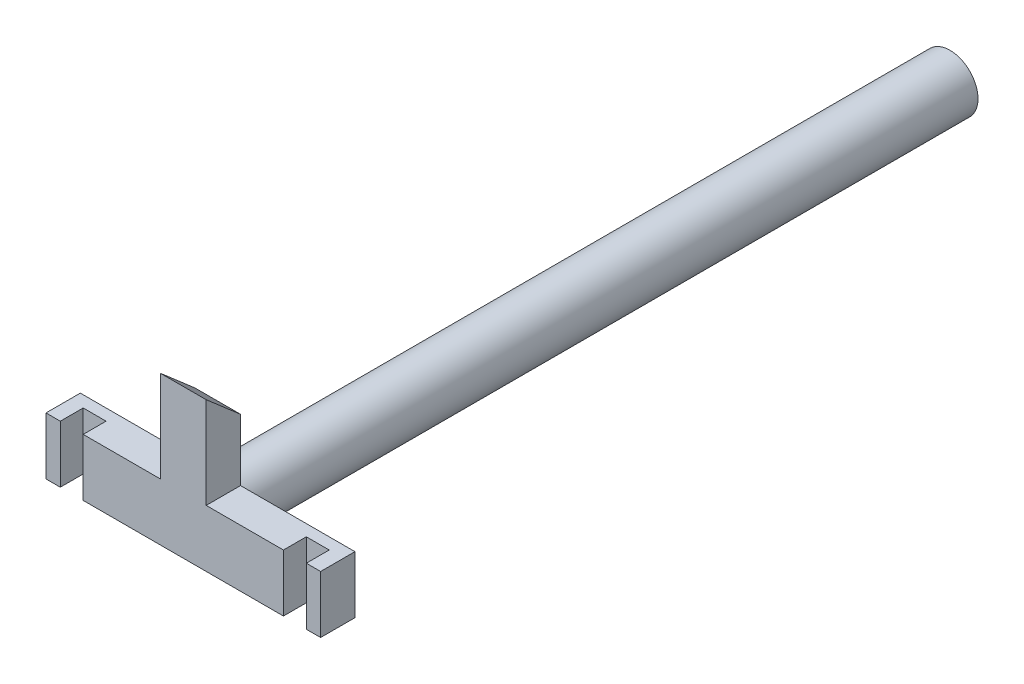
ISO-10303-21;
HEADER;
FILE_DESCRIPTION(('STEP AP214'),'2;1');
FILE_NAME('part.step','',(''),(''),'','','');
FILE_SCHEMA(('AUTOMOTIVE_DESIGN { 1 0 10303 214 1 1 1 1 }'));
ENDSEC;
DATA;
#1=APPLICATION_CONTEXT('core data for automotive mechanical design processes');
#2=APPLICATION_PROTOCOL_DEFINITION('international standard','automotive_design',2000,#1);
#3=PRODUCT_CONTEXT('',#1,'mechanical');
#4=PRODUCT('Part','Part','',(#3));
#5=PRODUCT_RELATED_PRODUCT_CATEGORY('part','',(#4));
#6=PRODUCT_DEFINITION_FORMATION('','',#4);
#7=PRODUCT_DEFINITION_CONTEXT('part definition',#1,'design');
#8=PRODUCT_DEFINITION('design','',#6,#7);
#9=PRODUCT_DEFINITION_SHAPE('','',#8);
#10=(LENGTH_UNIT() NAMED_UNIT(*) SI_UNIT(.MILLI.,.METRE.));
#11=(NAMED_UNIT(*) PLANE_ANGLE_UNIT() SI_UNIT($,.RADIAN.));
#12=(NAMED_UNIT(*) SI_UNIT($,.STERADIAN.) SOLID_ANGLE_UNIT());
#13=UNCERTAINTY_MEASURE_WITH_UNIT(LENGTH_MEASURE(1.E-05),#10,'distance_accuracy_value','');
#14=(GEOMETRIC_REPRESENTATION_CONTEXT(3) GLOBAL_UNCERTAINTY_ASSIGNED_CONTEXT((#13)) GLOBAL_UNIT_ASSIGNED_CONTEXT((#10,
#11,#12)) REPRESENTATION_CONTEXT('',''));
#15=CARTESIAN_POINT('',(0.,0.,0.));
#16=DIRECTION('',(0.,0.,1.));
#17=DIRECTION('',(1.,0.,0.));
#18=AXIS2_PLACEMENT_3D('',#15,#16,#17);
#19=CARTESIAN_POINT('',(-12.,2.5,67.));
#20=DIRECTION('',(0.,-1.,0.));
#21=DIRECTION('',(0.,0.,-1.));
#22=AXIS2_PLACEMENT_3D('',#19,#20,#21);
#23=PLANE('',#22);
#24=DIRECTION('',(0.,0.,1.));
#25=VECTOR('',#24,1.);
#26=CARTESIAN_POINT('',(-2.,2.5,55.0557280900008));
#27=LINE('',#26,#25);
#28=CARTESIAN_POINT('',(-2.,2.5,64.));
#29=VERTEX_POINT('',#28);
#30=CARTESIAN_POINT('',(-2.,2.5,67.));
#31=VERTEX_POINT('',#30);
#32=EDGE_CURVE('E68',#29,#31,#27,.T.);
#33=ORIENTED_EDGE('',*,*,#32,.F.);
#34=DIRECTION('',(-1.,0.,0.));
#35=VECTOR('',#34,1.);
#36=CARTESIAN_POINT('',(-12.,2.5,64.));
#37=LINE('',#36,#35);
#38=CARTESIAN_POINT('',(-12.,2.5,64.));
#39=VERTEX_POINT('',#38);
#40=EDGE_CURVE('E297',#29,#39,#37,.T.);
#41=ORIENTED_EDGE('',*,*,#40,.T.);
#42=DIRECTION('',(0.,0.,-1.));
#43=VECTOR('',#42,1.);
#44=CARTESIAN_POINT('',(-12.,2.5,67.));
#45=LINE('',#44,#43);
#46=CARTESIAN_POINT('',(-12.,2.5,67.));
#47=VERTEX_POINT('',#46);
#48=EDGE_CURVE('E313',#47,#39,#45,.T.);
#49=ORIENTED_EDGE('',*,*,#48,.F.);
#50=DIRECTION('',(-1.,0.,0.));
#51=VECTOR('',#50,1.);
#52=CARTESIAN_POINT('',(-12.,2.5,67.));
#53=LINE('',#52,#51);
#54=CARTESIAN_POINT('',(-10.75,2.5,67.));
#55=VERTEX_POINT('',#54);
#56=EDGE_CURVE('E277',#55,#47,#53,.T.);
#57=ORIENTED_EDGE('',*,*,#56,.F.);
#58=DIRECTION('',(0.,0.,1.));
#59=VECTOR('',#58,1.);
#60=CARTESIAN_POINT('',(-10.75,2.5,65.));
#61=LINE('',#60,#59);
#62=CARTESIAN_POINT('',(-10.75,2.5,65.));
#63=VERTEX_POINT('',#62);
#64=EDGE_CURVE('E242',#63,#55,#61,.T.);
#65=ORIENTED_EDGE('',*,*,#64,.F.);
#66=DIRECTION('',(-1.,0.,0.));
#67=VECTOR('',#66,1.);
#68=CARTESIAN_POINT('',(-8.75,2.5,65.));
#69=LINE('',#68,#67);
#70=CARTESIAN_POINT('',(-8.75,2.5,65.));
#71=VERTEX_POINT('',#70);
#72=EDGE_CURVE('E266',#71,#63,#69,.T.);
#73=ORIENTED_EDGE('',*,*,#72,.F.);
#74=DIRECTION('',(0.,0.,1.));
#75=VECTOR('',#74,1.);
#76=CARTESIAN_POINT('',(-8.75,2.5,65.));
#77=LINE('',#76,#75);
#78=CARTESIAN_POINT('',(-8.75,2.5,67.));
#79=VERTEX_POINT('',#78);
#80=EDGE_CURVE('E237',#71,#79,#77,.T.);
#81=ORIENTED_EDGE('',*,*,#80,.T.);
#82=EDGE_CURVE('E284',#31,#79,#53,.T.);
#83=ORIENTED_EDGE('',*,*,#82,.F.);
#84=EDGE_LOOP('',(#33,#41,#49,#57,#65,#73,#81,#83));
#85=FACE_BOUND('',#84,.T.);
#86=ADVANCED_FACE('F44',(#85),#23,.F.);
#87=CARTESIAN_POINT('',(0.,0.,67.));
#88=DIRECTION('',(0.,0.,1.));
#89=DIRECTION('',(1.,0.,0.));
#90=AXIS2_PLACEMENT_3D('',#87,#88,#89);
#91=PLANE('',#90);
#92=DIRECTION('',(0.,1.,0.));
#93=VECTOR('',#92,1.);
#94=CARTESIAN_POINT('',(10.75,2.5,67.));
#95=LINE('',#94,#93);
#96=CARTESIAN_POINT('',(10.75,-2.5,67.));
#97=VERTEX_POINT('',#96);
#98=CARTESIAN_POINT('',(10.75,2.5,67.));
#99=VERTEX_POINT('',#98);
#100=EDGE_CURVE('E217',#97,#99,#95,.T.);
#101=ORIENTED_EDGE('',*,*,#100,.F.);
#102=DIRECTION('',(1.,0.,0.));
#103=VECTOR('',#102,1.);
#104=CARTESIAN_POINT('',(-12.,-2.5,67.));
#105=LINE('',#104,#103);
#106=CARTESIAN_POINT('',(12.,-2.5,67.));
#107=VERTEX_POINT('',#106);
#108=EDGE_CURVE('E287',#97,#107,#105,.T.);
#109=ORIENTED_EDGE('',*,*,#108,.T.);
#110=DIRECTION('',(0.,1.,0.));
#111=VECTOR('',#110,1.);
#112=CARTESIAN_POINT('',(12.,2.5,67.));
#113=LINE('',#112,#111);
#114=CARTESIAN_POINT('',(12.,2.5,67.));
#115=VERTEX_POINT('',#114);
#116=EDGE_CURVE('E273',#107,#115,#113,.T.);
#117=ORIENTED_EDGE('',*,*,#116,.T.);
#118=EDGE_CURVE('E279',#115,#99,#53,.T.);
#119=ORIENTED_EDGE('',*,*,#118,.T.);
#120=EDGE_LOOP('',(#101,#109,#117,#119));
#121=FACE_BOUND('',#120,.T.);
#122=ADVANCED_FACE('F338',(#121),#91,.T.);
#123=DIRECTION('',(0.,-1.,0.));
#124=VECTOR('',#123,1.);
#125=CARTESIAN_POINT('',(8.75,2.5,67.));
#126=LINE('',#125,#124);
#127=CARTESIAN_POINT('',(8.75,2.5,67.));
#128=VERTEX_POINT('',#127);
#129=CARTESIAN_POINT('',(8.75,-2.5,67.));
#130=VERTEX_POINT('',#129);
#131=EDGE_CURVE('E204',#128,#130,#126,.T.);
#132=ORIENTED_EDGE('',*,*,#131,.F.);
#133=CARTESIAN_POINT('',(2.,2.5,67.));
#134=VERTEX_POINT('',#133);
#135=EDGE_CURVE('E184',#128,#134,#53,.T.);
#136=ORIENTED_EDGE('',*,*,#135,.T.);
#137=DIRECTION('',(0.,1.,0.));
#138=VECTOR('',#137,1.);
#139=CARTESIAN_POINT('',(2.,10.5,67.));
#140=LINE('',#139,#138);
#141=CARTESIAN_POINT('',(2.,10.5,67.));
#142=VERTEX_POINT('',#141);
#143=EDGE_CURVE('E172',#134,#142,#140,.T.);
#144=ORIENTED_EDGE('',*,*,#143,.T.);
#145=DIRECTION('',(-1.,0.,0.));
#146=VECTOR('',#145,1.);
#147=CARTESIAN_POINT('',(-2.,10.5,67.));
#148=LINE('',#147,#146);
#149=CARTESIAN_POINT('',(-2.,10.5,67.));
#150=VERTEX_POINT('',#149);
#151=EDGE_CURVE('E159',#142,#150,#148,.T.);
#152=ORIENTED_EDGE('',*,*,#151,.T.);
#153=DIRECTION('',(0.,-1.,0.));
#154=VECTOR('',#153,1.);
#155=CARTESIAN_POINT('',(-2.,10.5,67.));
#156=LINE('',#155,#154);
#157=EDGE_CURVE('E171',#150,#31,#156,.T.);
#158=ORIENTED_EDGE('',*,*,#157,.T.);
#159=ORIENTED_EDGE('',*,*,#82,.T.);
#160=DIRECTION('',(0.,1.,0.));
#161=VECTOR('',#160,1.);
#162=CARTESIAN_POINT('',(-8.75,2.5,67.));
#163=LINE('',#162,#161);
#164=CARTESIAN_POINT('',(-8.75,-2.5,67.));
#165=VERTEX_POINT('',#164);
#166=EDGE_CURVE('E220',#165,#79,#163,.T.);
#167=ORIENTED_EDGE('',*,*,#166,.F.);
#168=EDGE_CURVE('E293',#165,#130,#105,.T.);
#169=ORIENTED_EDGE('',*,*,#168,.T.);
#170=EDGE_LOOP('',(#132,#136,#144,#152,#158,#159,#167,#169));
#171=FACE_BOUND('',#170,.T.);
#172=ADVANCED_FACE('F183',(#171),#91,.T.);
#173=CARTESIAN_POINT('',(0.,0.,64.));
#174=DIRECTION('',(0.,0.,-1.));
#175=DIRECTION('',(-1.,0.,0.));
#176=AXIS2_PLACEMENT_3D('',#173,#174,#175);
#177=CYLINDRICAL_SURFACE('',#176,2.45);
#178=CARTESIAN_POINT('',(0.,0.,64.));
#179=DIRECTION('',(0.,0.,1.));
#180=DIRECTION('',(1.,0.,0.));
#181=AXIS2_PLACEMENT_3D('',#178,#179,#180);
#182=CIRCLE('',#181,2.45);
#183=CARTESIAN_POINT('',(2.45,0.,64.));
#184=VERTEX_POINT('',#183);
#185=EDGE_CURVE('E11',#184,#184,#182,.T.);
#186=ORIENTED_EDGE('',*,*,#185,.F.);
#187=EDGE_LOOP('',(#186));
#188=FACE_BOUND('',#187,.T.);
#189=CARTESIAN_POINT('',(0.,0.,0.));
#190=DIRECTION('',(0.,0.,1.));
#191=DIRECTION('',(1.,0.,0.));
#192=AXIS2_PLACEMENT_3D('',#189,#190,#191);
#193=CIRCLE('',#192,2.45);
#194=CARTESIAN_POINT('',(2.45,0.,0.));
#195=VERTEX_POINT('',#194);
#196=EDGE_CURVE('E48',#195,#195,#193,.T.);
#197=ORIENTED_EDGE('',*,*,#196,.T.);
#198=EDGE_LOOP('',(#197));
#199=FACE_BOUND('',#198,.T.);
#200=ADVANCED_FACE('F46',(#188,#199),#177,.T.);
#201=CARTESIAN_POINT('',(0.,0.,0.));
#202=DIRECTION('',(0.,0.,1.));
#203=DIRECTION('',(1.,0.,0.));
#204=AXIS2_PLACEMENT_3D('',#201,#202,#203);
#205=PLANE('',#204);
#206=ORIENTED_EDGE('',*,*,#196,.F.);
#207=EDGE_LOOP('',(#206));
#208=FACE_BOUND('',#207,.T.);
#209=ADVANCED_FACE('F326',(#208),#205,.F.);
#210=CARTESIAN_POINT('',(12.,2.5,67.));
#211=DIRECTION('',(-1.,0.,0.));
#212=DIRECTION('',(0.,0.,1.));
#213=AXIS2_PLACEMENT_3D('',#210,#211,#212);
#214=PLANE('',#213);
#215=DIRECTION('',(0.,1.,0.));
#216=VECTOR('',#215,1.);
#217=CARTESIAN_POINT('',(12.,2.5,64.));
#218=LINE('',#217,#216);
#219=CARTESIAN_POINT('',(12.,-2.5,64.));
#220=VERTEX_POINT('',#219);
#221=CARTESIAN_POINT('',(12.,2.5,64.));
#222=VERTEX_POINT('',#221);
#223=EDGE_CURVE('E226',#220,#222,#218,.T.);
#224=ORIENTED_EDGE('',*,*,#223,.T.);
#225=DIRECTION('',(0.,0.,-1.));
#226=VECTOR('',#225,1.);
#227=CARTESIAN_POINT('',(12.,2.5,67.));
#228=LINE('',#227,#226);
#229=EDGE_CURVE('E317',#115,#222,#228,.T.);
#230=ORIENTED_EDGE('',*,*,#229,.F.);
#231=ORIENTED_EDGE('',*,*,#116,.F.);
#232=DIRECTION('',(0.,0.,-1.));
#233=VECTOR('',#232,1.);
#234=CARTESIAN_POINT('',(12.,-2.5,67.));
#235=LINE('',#234,#233);
#236=EDGE_CURVE('E292',#107,#220,#235,.T.);
#237=ORIENTED_EDGE('',*,*,#236,.T.);
#238=EDGE_LOOP('',(#224,#230,#231,#237));
#239=FACE_BOUND('',#238,.T.);
#240=ADVANCED_FACE('F328',(#239),#214,.F.);
#241=CARTESIAN_POINT('',(2.,2.5,64.));
#242=VERTEX_POINT('',#241);
#243=EDGE_CURVE('E298',#222,#242,#37,.T.);
#244=ORIENTED_EDGE('',*,*,#243,.T.);
#245=DIRECTION('',(0.,0.,1.));
#246=VECTOR('',#245,1.);
#247=CARTESIAN_POINT('',(2.,2.5,55.0557280900008));
#248=LINE('',#247,#246);
#249=EDGE_CURVE('E60',#242,#134,#248,.T.);
#250=ORIENTED_EDGE('',*,*,#249,.T.);
#251=ORIENTED_EDGE('',*,*,#135,.F.);
#252=DIRECTION('',(0.,0.,1.));
#253=VECTOR('',#252,1.);
#254=CARTESIAN_POINT('',(8.75,2.5,65.));
#255=LINE('',#254,#253);
#256=CARTESIAN_POINT('',(8.75,2.5,65.));
#257=VERTEX_POINT('',#256);
#258=EDGE_CURVE('E231',#257,#128,#255,.T.);
#259=ORIENTED_EDGE('',*,*,#258,.F.);
#260=DIRECTION('',(-1.,0.,0.));
#261=VECTOR('',#260,1.);
#262=CARTESIAN_POINT('',(8.75,2.5,65.));
#263=LINE('',#262,#261);
#264=CARTESIAN_POINT('',(10.75,2.5,65.));
#265=VERTEX_POINT('',#264);
#266=EDGE_CURVE('E203',#265,#257,#263,.T.);
#267=ORIENTED_EDGE('',*,*,#266,.F.);
#268=DIRECTION('',(0.,0.,1.));
#269=VECTOR('',#268,1.);
#270=CARTESIAN_POINT('',(10.75,2.5,65.));
#271=LINE('',#270,#269);
#272=EDGE_CURVE('E216',#265,#99,#271,.T.);
#273=ORIENTED_EDGE('',*,*,#272,.T.);
#274=ORIENTED_EDGE('',*,*,#118,.F.);
#275=ORIENTED_EDGE('',*,*,#229,.T.);
#276=EDGE_LOOP('',(#244,#250,#251,#259,#267,#273,#274,#275));
#277=FACE_BOUND('',#276,.T.);
#278=ADVANCED_FACE('F333',(#277),#23,.F.);
#279=CARTESIAN_POINT('',(-12.,2.5,67.));
#280=DIRECTION('',(1.,0.,0.));
#281=DIRECTION('',(0.,0.,-1.));
#282=AXIS2_PLACEMENT_3D('',#279,#280,#281);
#283=PLANE('',#282);
#284=DIRECTION('',(0.,-1.,0.));
#285=VECTOR('',#284,1.);
#286=CARTESIAN_POINT('',(-12.,2.5,64.));
#287=LINE('',#286,#285);
#288=CARTESIAN_POINT('',(-12.,-2.5,64.));
#289=VERTEX_POINT('',#288);
#290=EDGE_CURVE('E301',#39,#289,#287,.T.);
#291=ORIENTED_EDGE('',*,*,#290,.T.);
#292=DIRECTION('',(0.,0.,-1.));
#293=VECTOR('',#292,1.);
#294=CARTESIAN_POINT('',(-12.,-2.5,67.));
#295=LINE('',#294,#293);
#296=CARTESIAN_POINT('',(-12.,-2.5,67.));
#297=VERTEX_POINT('',#296);
#298=EDGE_CURVE('E309',#297,#289,#295,.T.);
#299=ORIENTED_EDGE('',*,*,#298,.F.);
#300=DIRECTION('',(0.,-1.,0.));
#301=VECTOR('',#300,1.);
#302=CARTESIAN_POINT('',(-12.,2.5,67.));
#303=LINE('',#302,#301);
#304=EDGE_CURVE('E283',#47,#297,#303,.T.);
#305=ORIENTED_EDGE('',*,*,#304,.F.);
#306=ORIENTED_EDGE('',*,*,#48,.T.);
#307=EDGE_LOOP('',(#291,#299,#305,#306));
#308=FACE_BOUND('',#307,.T.);
#309=ADVANCED_FACE('F349',(#308),#283,.F.);
#310=CARTESIAN_POINT('',(-12.,-2.5,67.));
#311=DIRECTION('',(0.,1.,0.));
#312=DIRECTION('',(0.,0.,1.));
#313=AXIS2_PLACEMENT_3D('',#310,#311,#312);
#314=PLANE('',#313);
#315=ORIENTED_EDGE('',*,*,#108,.F.);
#316=DIRECTION('',(0.,0.,1.));
#317=VECTOR('',#316,1.);
#318=CARTESIAN_POINT('',(10.75,-2.5,65.));
#319=LINE('',#318,#317);
#320=CARTESIAN_POINT('',(10.75,-2.5,65.));
#321=VERTEX_POINT('',#320);
#322=EDGE_CURVE('E223',#321,#97,#319,.T.);
#323=ORIENTED_EDGE('',*,*,#322,.F.);
#324=DIRECTION('',(1.,0.,0.));
#325=VECTOR('',#324,1.);
#326=CARTESIAN_POINT('',(8.75,-2.5,65.));
#327=LINE('',#326,#325);
#328=CARTESIAN_POINT('',(8.75,-2.5,65.));
#329=VERTEX_POINT('',#328);
#330=EDGE_CURVE('E212',#329,#321,#327,.T.);
#331=ORIENTED_EDGE('',*,*,#330,.F.);
#332=DIRECTION('',(0.,0.,1.));
#333=VECTOR('',#332,1.);
#334=CARTESIAN_POINT('',(8.75,-2.5,65.));
#335=LINE('',#334,#333);
#336=EDGE_CURVE('E227',#329,#130,#335,.T.);
#337=ORIENTED_EDGE('',*,*,#336,.T.);
#338=ORIENTED_EDGE('',*,*,#168,.F.);
#339=DIRECTION('',(0.,0.,1.));
#340=VECTOR('',#339,1.);
#341=CARTESIAN_POINT('',(-8.75,-2.5,65.));
#342=LINE('',#341,#340);
#343=CARTESIAN_POINT('',(-8.75,-2.5,65.));
#344=VERTEX_POINT('',#343);
#345=EDGE_CURVE('E249',#344,#165,#342,.T.);
#346=ORIENTED_EDGE('',*,*,#345,.F.);
#347=DIRECTION('',(1.,0.,0.));
#348=VECTOR('',#347,1.);
#349=CARTESIAN_POINT('',(-8.75,-2.5,65.));
#350=LINE('',#349,#348);
#351=CARTESIAN_POINT('',(-10.75,-2.5,65.));
#352=VERTEX_POINT('',#351);
#353=EDGE_CURVE('E241',#352,#344,#350,.T.);
#354=ORIENTED_EDGE('',*,*,#353,.F.);
#355=DIRECTION('',(0.,0.,1.));
#356=VECTOR('',#355,1.);
#357=CARTESIAN_POINT('',(-10.75,-2.5,65.));
#358=LINE('',#357,#356);
#359=CARTESIAN_POINT('',(-10.75,-2.5,67.));
#360=VERTEX_POINT('',#359);
#361=EDGE_CURVE('E245',#352,#360,#358,.T.);
#362=ORIENTED_EDGE('',*,*,#361,.T.);
#363=EDGE_CURVE('E288',#297,#360,#105,.T.);
#364=ORIENTED_EDGE('',*,*,#363,.F.);
#365=ORIENTED_EDGE('',*,*,#298,.T.);
#366=DIRECTION('',(1.,0.,0.));
#367=VECTOR('',#366,1.);
#368=CARTESIAN_POINT('',(-12.,-2.5,64.));
#369=LINE('',#368,#367);
#370=EDGE_CURVE('E278',#289,#220,#369,.T.);
#371=ORIENTED_EDGE('',*,*,#370,.T.);
#372=ORIENTED_EDGE('',*,*,#236,.F.);
#373=EDGE_LOOP('',(#315,#323,#331,#337,#338,#346,#354,#362,#364,#365,#371,#372));
#374=FACE_BOUND('',#373,.T.);
#375=ADVANCED_FACE('F354',(#374),#314,.F.);
#376=DIRECTION('',(0.,-1.,0.));
#377=VECTOR('',#376,1.);
#378=CARTESIAN_POINT('',(-10.75,2.5,67.));
#379=LINE('',#378,#377);
#380=EDGE_CURVE('E252',#55,#360,#379,.T.);
#381=ORIENTED_EDGE('',*,*,#380,.F.);
#382=ORIENTED_EDGE('',*,*,#56,.T.);
#383=ORIENTED_EDGE('',*,*,#304,.T.);
#384=ORIENTED_EDGE('',*,*,#363,.T.);
#385=EDGE_LOOP('',(#381,#382,#383,#384));
#386=FACE_BOUND('',#385,.T.);
#387=ADVANCED_FACE('F347',(#386),#91,.T.);
#388=CARTESIAN_POINT('',(0.,0.,64.));
#389=DIRECTION('',(0.,0.,1.));
#390=DIRECTION('',(1.,0.,0.));
#391=AXIS2_PLACEMENT_3D('',#388,#389,#390);
#392=PLANE('',#391);
#393=ORIENTED_EDGE('',*,*,#185,.T.);
#394=EDGE_LOOP('',(#393));
#395=FACE_BOUND('',#394,.T.);
#396=DIRECTION('',(0.,1.,0.));
#397=VECTOR('',#396,1.);
#398=CARTESIAN_POINT('',(-2.,10.5,64.));
#399=LINE('',#398,#397);
#400=CARTESIAN_POINT('',(-2.,7.9,64.));
#401=VERTEX_POINT('',#400);
#402=EDGE_CURVE('E196',#29,#401,#399,.T.);
#403=ORIENTED_EDGE('',*,*,#402,.T.);
#404=DIRECTION('',(1.,0.,0.));
#405=VECTOR('',#404,1.);
#406=CARTESIAN_POINT('',(-12.001,7.9,64.));
#407=LINE('',#406,#405);
#408=CARTESIAN_POINT('',(2.,7.9,64.));
#409=VERTEX_POINT('',#408);
#410=EDGE_CURVE('E180',#401,#409,#407,.T.);
#411=ORIENTED_EDGE('',*,*,#410,.T.);
#412=DIRECTION('',(0.,-1.,0.));
#413=VECTOR('',#412,1.);
#414=CARTESIAN_POINT('',(2.,10.5,64.));
#415=LINE('',#414,#413);
#416=EDGE_CURVE('E178',#409,#242,#415,.T.);
#417=ORIENTED_EDGE('',*,*,#416,.T.);
#418=ORIENTED_EDGE('',*,*,#243,.F.);
#419=ORIENTED_EDGE('',*,*,#223,.F.);
#420=ORIENTED_EDGE('',*,*,#370,.F.);
#421=ORIENTED_EDGE('',*,*,#290,.F.);
#422=ORIENTED_EDGE('',*,*,#40,.F.);
#423=EDGE_LOOP('',(#403,#411,#417,#418,#419,#420,#421,#422));
#424=FACE_BOUND('',#423,.T.);
#425=ADVANCED_FACE('F359',(#395,#424),#392,.F.);
#426=CARTESIAN_POINT('',(-8.75,2.5,65.));
#427=DIRECTION('',(1.,0.,0.));
#428=DIRECTION('',(0.,0.,-1.));
#429=AXIS2_PLACEMENT_3D('',#426,#427,#428);
#430=PLANE('',#429);
#431=ORIENTED_EDGE('',*,*,#166,.T.);
#432=ORIENTED_EDGE('',*,*,#80,.F.);
#433=DIRECTION('',(0.,1.,0.));
#434=VECTOR('',#433,1.);
#435=CARTESIAN_POINT('',(-8.75,2.5,65.));
#436=LINE('',#435,#434);
#437=EDGE_CURVE('E255',#344,#71,#436,.T.);
#438=ORIENTED_EDGE('',*,*,#437,.F.);
#439=ORIENTED_EDGE('',*,*,#345,.T.);
#440=EDGE_LOOP('',(#431,#432,#438,#439));
#441=FACE_BOUND('',#440,.T.);
#442=ADVANCED_FACE('F374',(#441),#430,.F.);
#443=CARTESIAN_POINT('',(-10.75,2.5,65.));
#444=DIRECTION('',(-1.,0.,0.));
#445=DIRECTION('',(0.,0.,1.));
#446=AXIS2_PLACEMENT_3D('',#443,#444,#445);
#447=PLANE('',#446);
#448=ORIENTED_EDGE('',*,*,#380,.T.);
#449=ORIENTED_EDGE('',*,*,#361,.F.);
#450=DIRECTION('',(0.,-1.,0.));
#451=VECTOR('',#450,1.);
#452=CARTESIAN_POINT('',(-10.75,2.5,65.));
#453=LINE('',#452,#451);
#454=EDGE_CURVE('E262',#63,#352,#453,.T.);
#455=ORIENTED_EDGE('',*,*,#454,.F.);
#456=ORIENTED_EDGE('',*,*,#64,.T.);
#457=EDGE_LOOP('',(#448,#449,#455,#456));
#458=FACE_BOUND('',#457,.T.);
#459=ADVANCED_FACE('F401',(#458),#447,.F.);
#460=CARTESIAN_POINT('',(0.,0.,65.));
#461=DIRECTION('',(0.,0.,-1.));
#462=DIRECTION('',(-1.,0.,0.));
#463=AXIS2_PLACEMENT_3D('',#460,#461,#462);
#464=PLANE('',#463);
#465=ORIENTED_EDGE('',*,*,#437,.T.);
#466=ORIENTED_EDGE('',*,*,#72,.T.);
#467=ORIENTED_EDGE('',*,*,#454,.T.);
#468=ORIENTED_EDGE('',*,*,#353,.T.);
#469=EDGE_LOOP('',(#465,#466,#467,#468));
#470=FACE_BOUND('',#469,.T.);
#471=ADVANCED_FACE('F380',(#470),#464,.F.);
#472=CARTESIAN_POINT('',(10.75,2.5,65.));
#473=DIRECTION('',(1.,0.,0.));
#474=DIRECTION('',(0.,0.,-1.));
#475=AXIS2_PLACEMENT_3D('',#472,#473,#474);
#476=PLANE('',#475);
#477=ORIENTED_EDGE('',*,*,#100,.T.);
#478=ORIENTED_EDGE('',*,*,#272,.F.);
#479=DIRECTION('',(0.,1.,0.));
#480=VECTOR('',#479,1.);
#481=CARTESIAN_POINT('',(10.75,2.5,65.));
#482=LINE('',#481,#480);
#483=EDGE_CURVE('E199',#321,#265,#482,.T.);
#484=ORIENTED_EDGE('',*,*,#483,.F.);
#485=ORIENTED_EDGE('',*,*,#322,.T.);
#486=EDGE_LOOP('',(#477,#478,#484,#485));
#487=FACE_BOUND('',#486,.T.);
#488=ADVANCED_FACE('F408',(#487),#476,.F.);
#489=CARTESIAN_POINT('',(8.75,2.5,65.));
#490=DIRECTION('',(-1.,0.,0.));
#491=DIRECTION('',(0.,0.,1.));
#492=AXIS2_PLACEMENT_3D('',#489,#490,#491);
#493=PLANE('',#492);
#494=ORIENTED_EDGE('',*,*,#131,.T.);
#495=ORIENTED_EDGE('',*,*,#336,.F.);
#496=DIRECTION('',(0.,-1.,0.));
#497=VECTOR('',#496,1.);
#498=CARTESIAN_POINT('',(8.75,2.5,65.));
#499=LINE('',#498,#497);
#500=EDGE_CURVE('E208',#257,#329,#499,.T.);
#501=ORIENTED_EDGE('',*,*,#500,.F.);
#502=ORIENTED_EDGE('',*,*,#258,.T.);
#503=EDGE_LOOP('',(#494,#495,#501,#502));
#504=FACE_BOUND('',#503,.T.);
#505=ADVANCED_FACE('F460',(#504),#493,.F.);
#506=CARTESIAN_POINT('',(0.,0.,65.));
#507=DIRECTION('',(0.,0.,1.));
#508=DIRECTION('',(1.,0.,0.));
#509=AXIS2_PLACEMENT_3D('',#506,#507,#508);
#510=PLANE('',#509);
#511=ORIENTED_EDGE('',*,*,#483,.T.);
#512=ORIENTED_EDGE('',*,*,#266,.T.);
#513=ORIENTED_EDGE('',*,*,#500,.T.);
#514=ORIENTED_EDGE('',*,*,#330,.T.);
#515=EDGE_LOOP('',(#511,#512,#513,#514));
#516=FACE_BOUND('',#515,.T.);
#517=ADVANCED_FACE('F470',(#516),#510,.T.);
#518=CARTESIAN_POINT('',(2.,10.5,55.0557280900008));
#519=DIRECTION('',(1.,0.,0.));
#520=DIRECTION('',(0.,1.,0.));
#521=AXIS2_PLACEMENT_3D('',#518,#519,#520);
#522=PLANE('',#521);
#523=DIRECTION('',(0.,-0.654930538417842,-0.755689082789818));
#524=VECTOR('',#523,1.);
#525=CARTESIAN_POINT('',(2.,10.5,67.));
#526=LINE('',#525,#524);
#527=EDGE_CURVE('E162',#142,#409,#526,.T.);
#528=ORIENTED_EDGE('',*,*,#527,.F.);
#529=ORIENTED_EDGE('',*,*,#143,.F.);
#530=ORIENTED_EDGE('',*,*,#249,.F.);
#531=ORIENTED_EDGE('',*,*,#416,.F.);
#532=EDGE_LOOP('',(#528,#529,#530,#531));
#533=FACE_BOUND('',#532,.T.);
#534=ADVANCED_FACE('F177',(#533),#522,.T.);
#535=CARTESIAN_POINT('',(-2.,10.5,55.0557280900008));
#536=DIRECTION('',(-1.,0.,0.));
#537=DIRECTION('',(0.,-1.,0.));
#538=AXIS2_PLACEMENT_3D('',#535,#536,#537);
#539=PLANE('',#538);
#540=DIRECTION('',(0.,-0.654930538417842,-0.755689082789818));
#541=VECTOR('',#540,1.);
#542=CARTESIAN_POINT('',(-2.,10.5,67.));
#543=LINE('',#542,#541);
#544=EDGE_CURVE('E165',#150,#401,#543,.T.);
#545=ORIENTED_EDGE('',*,*,#544,.T.);
#546=ORIENTED_EDGE('',*,*,#402,.F.);
#547=ORIENTED_EDGE('',*,*,#32,.T.);
#548=ORIENTED_EDGE('',*,*,#157,.F.);
#549=EDGE_LOOP('',(#545,#546,#547,#548));
#550=FACE_BOUND('',#549,.T.);
#551=ADVANCED_FACE('F368',(#550),#539,.T.);
#552=CARTESIAN_POINT('',(-12.001,10.5,67.));
#553=DIRECTION('',(0.,-0.755689082789818,0.654930538417842));
#554=DIRECTION('',(0.,-0.654930538417842,-0.755689082789818));
#555=AXIS2_PLACEMENT_3D('',#552,#553,#554);
#556=PLANE('',#555);
#557=ORIENTED_EDGE('',*,*,#151,.F.);
#558=ORIENTED_EDGE('',*,*,#527,.T.);
#559=ORIENTED_EDGE('',*,*,#410,.F.);
#560=ORIENTED_EDGE('',*,*,#544,.F.);
#561=EDGE_LOOP('',(#557,#558,#559,#560));
#562=FACE_BOUND('',#561,.T.);
#563=ADVANCED_FACE('F161',(#562),#556,.F.);
#564=CLOSED_SHELL('',(#86,#122,#172,#200,#209,#240,#278,#309,#375,#387,#425,#442,#459,#471,#488,
#505,#517,#534,#551,#563));
#565=MANIFOLD_SOLID_BREP('B2',#564);
#566=ADVANCED_BREP_SHAPE_REPRESENTATION('',(#18,#565),#14);
#567=SHAPE_DEFINITION_REPRESENTATION(#9,#566);
ENDSEC;
END-ISO-10303-21;
